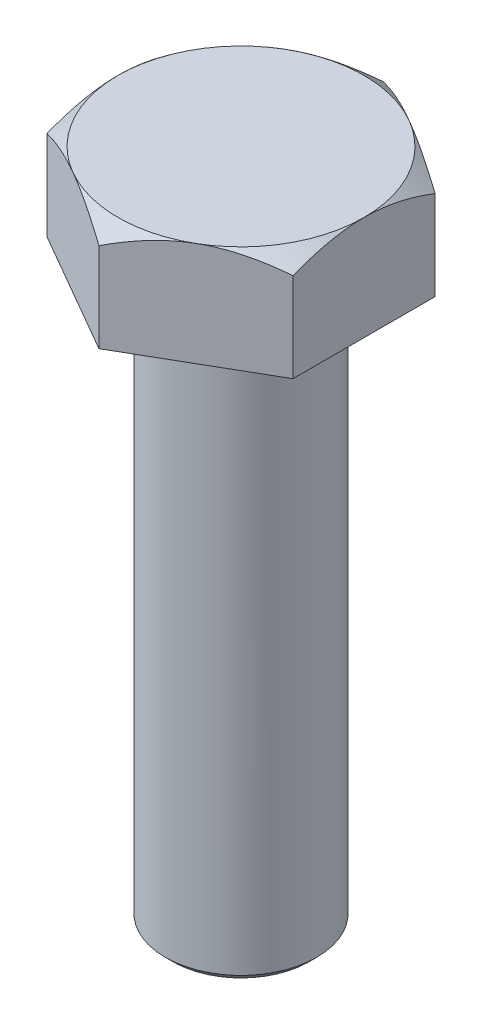
ISO-10303-21;
HEADER;
FILE_DESCRIPTION(('STEP AP214'),'2;1');
FILE_NAME('part.step','',(''),(''),'','','');
FILE_SCHEMA(('AUTOMOTIVE_DESIGN { 1 0 10303 214 1 1 1 1 }'));
ENDSEC;
DATA;
#1=APPLICATION_CONTEXT('core data for automotive mechanical design processes');
#2=APPLICATION_PROTOCOL_DEFINITION('international standard','automotive_design',2000,#1);
#3=PRODUCT_CONTEXT('',#1,'mechanical');
#4=PRODUCT('Part','Part','',(#3));
#5=PRODUCT_RELATED_PRODUCT_CATEGORY('part','',(#4));
#6=PRODUCT_DEFINITION_FORMATION('','',#4);
#7=PRODUCT_DEFINITION_CONTEXT('part definition',#1,'design');
#8=PRODUCT_DEFINITION('design','',#6,#7);
#9=PRODUCT_DEFINITION_SHAPE('','',#8);
#10=(LENGTH_UNIT() NAMED_UNIT(*) SI_UNIT(.MILLI.,.METRE.));
#11=(NAMED_UNIT(*) PLANE_ANGLE_UNIT() SI_UNIT($,.RADIAN.));
#12=(NAMED_UNIT(*) SI_UNIT($,.STERADIAN.) SOLID_ANGLE_UNIT());
#13=UNCERTAINTY_MEASURE_WITH_UNIT(LENGTH_MEASURE(1.E-05),#10,'distance_accuracy_value','');
#14=(GEOMETRIC_REPRESENTATION_CONTEXT(3) GLOBAL_UNCERTAINTY_ASSIGNED_CONTEXT((#13)) GLOBAL_UNIT_ASSIGNED_CONTEXT((#10,
#11,#12)) REPRESENTATION_CONTEXT('',''));
#15=CARTESIAN_POINT('',(0.,0.,0.));
#16=DIRECTION('',(0.,0.,1.));
#17=DIRECTION('',(1.,0.,0.));
#18=AXIS2_PLACEMENT_3D('',#15,#16,#17);
#19=CARTESIAN_POINT('',(-6.5,35.5,3.75277674973257));
#20=DIRECTION('',(0.5,0.,-0.866025403784438));
#21=DIRECTION('',(-0.866025403784439,0.,-0.5));
#22=AXIS2_PLACEMENT_3D('',#19,#20,#21);
#23=PLANE('',#22);
#24=CARTESIAN_POINT('',(-6.5002,34.7142852870091,3.75266127967873));
#25=CARTESIAN_POINT('',(-6.26849183615579,34.818755788061,3.88643805044762));
#26=CARTESIAN_POINT('',(-6.03413643113228,34.9161448767212,4.02174320662399));
#27=CARTESIAN_POINT('',(-5.55955625459309,35.0926798919872,4.29574219930095));
#28=CARTESIAN_POINT('',(-5.31931535970643,35.1717675567921,4.43444534463412));
#29=CARTESIAN_POINT('',(-4.83614836656162,35.3062674154687,4.71340193818982));
#30=CARTESIAN_POINT('',(-4.59326932277981,35.3618969702887,4.85362821949777));
#31=CARTESIAN_POINT('',(-4.22653437863661,35.425291328794,5.06536273822008));
#32=CARTESIAN_POINT('',(-4.10394057395098,35.4430777321858,5.13614230435631));
#33=CARTESIAN_POINT('',(-3.85814692242963,35.4716314506099,5.27805133522726));
#34=CARTESIAN_POINT('',(-3.73494716194625,35.4823997381448,5.34918075010644));
#35=CARTESIAN_POINT('',(-3.48636363850025,35.4967758792946,5.4927005142841));
#36=CARTESIAN_POINT('',(-3.36097505053948,35.5002728507988,5.56509364929655));
#37=CARTESIAN_POINT('',(-3.11021045258304,35.4996938835069,5.70987265742993));
#38=CARTESIAN_POINT('',(-2.98483444266605,35.4956178999724,5.78225853050543));
#39=CARTESIAN_POINT('',(-2.73437881037612,35.4799860889839,5.92685915722808));
#40=CARTESIAN_POINT('',(-2.60929934035414,35.4684270141369,5.99907382291536));
#41=CARTESIAN_POINT('',(-2.3597915590094,35.438101268874,6.14312720763965));
#42=CARTESIAN_POINT('',(-2.2353633393163,35.419333610464,6.21496587377425));
#43=CARTESIAN_POINT('',(-1.86352330890096,35.3528145131007,6.42964781543003));
#44=CARTESIAN_POINT('',(-1.61745179224297,35.294839870839,6.57171727181242));
#45=CARTESIAN_POINT('',(-1.13040722975498,35.1559389409286,6.8529125810722));
#46=CARTESIAN_POINT('',(-0.889433126713771,35.07501746365,6.99203904433077));
#47=CARTESIAN_POINT('',(-0.541329471029829,34.9433811950942,7.19301678364579));
#48=CARTESIAN_POINT('',(-0.432091820985262,34.8999061969859,7.25608517030466));
#49=CARTESIAN_POINT('',(-0.214996676551416,34.8095612104902,7.38142511038331));
#50=CARTESIAN_POINT('',(-0.107136313351479,34.7627004273152,7.44369832011168));
#51=CARTESIAN_POINT('',(0.00020000000000236,34.7142852870092,7.50566896951898));
#52=B_SPLINE_CURVE_WITH_KNOTS('',3,(#24,#25,#26,#27,#28,#29,#30,#31,#32,#33,#34,#35,#36,#37,#38,
#39,#40,#41,#42,#43,#44,#45,#46,#47,#48,#49,#50,#51),.UNSPECIFIED.,.F.,.F.,(4,2,2,2,2,2,2,2,2,2,
2,2,2,4),(0.,0.861976942107793,1.72666131720615,2.5831475047865,3.01101814330345,
3.43882947904054,3.87311815490263,4.30740939640629,4.74188923116733,5.17642863612659,
6.04514696556895,6.91368331909186,7.31389878440711,7.71306436975967),.UNSPECIFIED.);
#53=CARTESIAN_POINT('',(-6.5,34.7143755041844,3.75277674973257));
#54=VERTEX_POINT('',#53);
#55=CARTESIAN_POINT('',(-3.25,35.5,5.62916512459885));
#56=VERTEX_POINT('',#55);
#57=EDGE_CURVE('E173',#54,#56,#52,.T.);
#58=ORIENTED_EDGE('',*,*,#57,.F.);
#59=DIRECTION('',(0.,-1.,0.));
#60=VECTOR('',#59,1.);
#61=CARTESIAN_POINT('',(-6.5,35.5,3.75277674973257));
#62=LINE('',#61,#60);
#63=CARTESIAN_POINT('',(-6.5,30.,3.75277674973257));
#64=VERTEX_POINT('',#63);
#65=EDGE_CURVE('E192',#54,#64,#62,.T.);
#66=ORIENTED_EDGE('',*,*,#65,.T.);
#67=DIRECTION('',(0.866025403784439,0.,0.5));
#68=VECTOR('',#67,1.);
#69=CARTESIAN_POINT('',(-6.5,30.,3.75277674973257));
#70=LINE('',#69,#68);
#71=CARTESIAN_POINT('',(0.,30.,7.50555349946514));
#72=VERTEX_POINT('',#71);
#73=EDGE_CURVE('E175',#64,#72,#70,.T.);
#74=ORIENTED_EDGE('',*,*,#73,.T.);
#75=DIRECTION('',(0.,-1.,0.));
#76=VECTOR('',#75,1.);
#77=CARTESIAN_POINT('',(0.,35.5,7.50555349946514));
#78=LINE('',#77,#76);
#79=CARTESIAN_POINT('',(0.,34.7143755041844,7.50555349946514));
#80=VERTEX_POINT('',#79);
#81=EDGE_CURVE('E201',#80,#72,#78,.T.);
#82=ORIENTED_EDGE('',*,*,#81,.F.);
#83=EDGE_CURVE('E168',#56,#80,#52,.T.);
#84=ORIENTED_EDGE('',*,*,#83,.F.);
#85=EDGE_LOOP('',(#58,#66,#74,#82,#84));
#86=FACE_BOUND('',#85,.T.);
#87=ADVANCED_FACE('F34',(#86),#23,.F.);
#88=CARTESIAN_POINT('',(0.,35.5,7.50555349946514));
#89=DIRECTION('',(-0.5,0.,-0.866025403784438));
#90=DIRECTION('',(-0.866025403784439,0.,0.5));
#91=AXIS2_PLACEMENT_3D('',#88,#89,#90);
#92=PLANE('',#91);
#93=CARTESIAN_POINT('',(-0.000200000000001718,34.7142852870091,7.50566896951898));
#94=CARTESIAN_POINT('',(0.231508163844212,34.818755788061,7.37189219875008));
#95=CARTESIAN_POINT('',(0.465863568867719,34.9161448767212,7.23658704257372));
#96=CARTESIAN_POINT('',(0.940443745406907,35.0926798919872,6.96258804989676));
#97=CARTESIAN_POINT('',(1.18068464029357,35.1717675567921,6.82388490456359));
#98=CARTESIAN_POINT('',(1.66385163343838,35.3062674154687,6.54492831100789));
#99=CARTESIAN_POINT('',(1.90673067722019,35.3618969702887,6.40470202969994));
#100=CARTESIAN_POINT('',(2.27346562136339,35.425291328794,6.19296751097762));
#101=CARTESIAN_POINT('',(2.39605942604902,35.4430777321858,6.12218794484139));
#102=CARTESIAN_POINT('',(2.64185307757036,35.4716314506099,5.98027891397044));
#103=CARTESIAN_POINT('',(2.76505283805375,35.4823997381448,5.90914949909127));
#104=CARTESIAN_POINT('',(3.01363636149975,35.4967758792946,5.76562973491361));
#105=CARTESIAN_POINT('',(3.13902494946052,35.5002728507988,5.69323659990115));
#106=CARTESIAN_POINT('',(3.38978954741696,35.4996938835069,5.54845759176777));
#107=CARTESIAN_POINT('',(3.51516555733394,35.4956178999724,5.47607171869228));
#108=CARTESIAN_POINT('',(3.76562118962388,35.4799860889838,5.33147109196963));
#109=CARTESIAN_POINT('',(3.89070065964586,35.4684270141369,5.25925642628234));
#110=CARTESIAN_POINT('',(4.1402084409906,35.438101268874,5.11520304155805));
#111=CARTESIAN_POINT('',(4.26463666068369,35.419333610464,5.04336437542346));
#112=CARTESIAN_POINT('',(4.63647669109904,35.3528145131007,4.82868243376768));
#113=CARTESIAN_POINT('',(4.88254820775703,35.294839870839,4.68661297738529));
#114=CARTESIAN_POINT('',(5.36959277024502,35.1559389409286,4.4054176681255));
#115=CARTESIAN_POINT('',(5.61056687328623,35.0750174636501,4.26629120486693));
#116=CARTESIAN_POINT('',(5.95867052897017,34.9433811950943,4.06531346555192));
#117=CARTESIAN_POINT('',(6.06790817901473,34.8999061969859,4.00224507889305));
#118=CARTESIAN_POINT('',(6.28500332344858,34.8095612104902,3.8769051388144));
#119=CARTESIAN_POINT('',(6.39286368664852,34.7627004273152,3.81463192908603));
#120=CARTESIAN_POINT('',(6.5002,34.7142852870092,3.75266127967873));
#121=B_SPLINE_CURVE_WITH_KNOTS('',3,(#93,#94,#95,#96,#97,#98,#99,#100,#101,#102,#103,#104,#105,
#106,#107,#108,#109,#110,#111,#112,#113,#114,#115,#116,#117,#118,#119,#120),.UNSPECIFIED.,.F.,
.F.,(4,2,2,2,2,2,2,2,2,2,2,2,2,4),(0.,0.861976942107792,1.72666131720615,2.5831475047865,
3.01101814330345,3.43882947904054,3.87311815490263,4.30740939640629,4.74188923116733,
5.17642863612658,6.04514696556895,6.91368331909186,7.31389878440711,7.71306436975967),.UNSPECIFIED.);
#122=CARTESIAN_POINT('',(3.25,35.5,5.62916512459885));
#123=VERTEX_POINT('',#122);
#124=EDGE_CURVE('E174',#80,#123,#121,.T.);
#125=ORIENTED_EDGE('',*,*,#124,.F.);
#126=ORIENTED_EDGE('',*,*,#81,.T.);
#127=DIRECTION('',(0.866025403784439,0.,-0.5));
#128=VECTOR('',#127,1.);
#129=CARTESIAN_POINT('',(0.,30.,7.50555349946514));
#130=LINE('',#129,#128);
#131=CARTESIAN_POINT('',(6.5,30.,3.75277674973257));
#132=VERTEX_POINT('',#131);
#133=EDGE_CURVE('E178',#72,#132,#130,.T.);
#134=ORIENTED_EDGE('',*,*,#133,.T.);
#135=DIRECTION('',(0.,-1.,0.));
#136=VECTOR('',#135,1.);
#137=CARTESIAN_POINT('',(6.5,35.5,3.75277674973257));
#138=LINE('',#137,#136);
#139=CARTESIAN_POINT('',(6.5,34.7143755041844,3.75277674973257));
#140=VERTEX_POINT('',#139);
#141=EDGE_CURVE('E199',#140,#132,#138,.T.);
#142=ORIENTED_EDGE('',*,*,#141,.F.);
#143=EDGE_CURVE('E110',#123,#140,#121,.T.);
#144=ORIENTED_EDGE('',*,*,#143,.F.);
#145=EDGE_LOOP('',(#125,#126,#134,#142,#144));
#146=FACE_BOUND('',#145,.T.);
#147=ADVANCED_FACE('F155',(#146),#92,.F.);
#148=CARTESIAN_POINT('',(6.5,35.5,3.75277674973257));
#149=DIRECTION('',(-1.,0.,0.));
#150=DIRECTION('',(0.,0.,1.));
#151=AXIS2_PLACEMENT_3D('',#148,#149,#150);
#152=PLANE('',#151);
#153=CARTESIAN_POINT('',(6.49999999999999,32.0576259629293,-8.7573775439131));
#154=CARTESIAN_POINT('',(6.49999999999999,32.2007873259403,-8.52912506204232));
#155=CARTESIAN_POINT('',(6.49999999999999,32.3425767251503,-8.29999766626221));
#156=CARTESIAN_POINT('',(6.49999999999999,32.6227298730685,-7.83959554875494));
#157=CARTESIAN_POINT('',(6.49999999999999,32.761092908265,-7.60832039333499));
#158=CARTESIAN_POINT('',(6.49999999999999,33.0345691404348,-7.14175435929315));
#159=CARTESIAN_POINT('',(6.49999999999999,33.1696541956528,-6.90644692936201));
#160=CARTESIAN_POINT('',(6.49999999999999,33.4346049980946,-6.43292116249189));
#161=CARTESIAN_POINT('',(6.49999999999999,33.5644710540464,-6.19470299882656));
#162=CARTESIAN_POINT('',(6.49999999999999,33.8239350678482,-5.7030759023016));
#163=CARTESIAN_POINT('',(6.5,33.9532080909825,-5.44949457697888));
#164=CARTESIAN_POINT('',(6.5,34.2027351997037,-4.93786027676595));
#165=CARTESIAN_POINT('',(6.5,34.3229880443171,-4.67980669258362));
#166=CARTESIAN_POINT('',(6.5,34.55165641351,-4.15924350117993));
#167=CARTESIAN_POINT('',(6.5,34.6601012001704,-3.89674686227773));
#168=CARTESIAN_POINT('',(6.5,34.862268323803,-3.36618937632092));
#169=CARTESIAN_POINT('',(6.5,34.9559963369902,-3.0981307199071));
#170=CARTESIAN_POINT('',(6.5,35.1257294167069,-2.55343517877316));
#171=CARTESIAN_POINT('',(6.5,35.2015479452172,-2.27673932818551));
#172=CARTESIAN_POINT('',(6.5,35.3297768853184,-1.71783833968318));
#173=CARTESIAN_POINT('',(6.5,35.3821900704915,-1.43563385869159));
#174=CARTESIAN_POINT('',(6.5,35.4399370840294,-1.01206552100857));
#175=CARTESIAN_POINT('',(6.5,35.4556573523712,-0.872073638912203));
#176=CARTESIAN_POINT('',(6.5,35.4801786727414,-0.591492014508092));
#177=CARTESIAN_POINT('',(6.5,35.4889806527419,-0.450902354926505));
#178=CARTESIAN_POINT('',(6.5,35.4994616946384,-0.169452364006));
#179=CARTESIAN_POINT('',(6.5,35.5011405849447,-0.0285920262284293));
#180=CARTESIAN_POINT('',(6.5,35.4973459893773,0.25302077100524));
#181=CARTESIAN_POINT('',(6.5,35.4918725976269,0.393773231856595));
#182=CARTESIAN_POINT('',(6.5,35.4662937548648,0.793139753593917));
#183=CARTESIAN_POINT('',(6.5,35.4377507670825,1.05125365317115));
#184=CARTESIAN_POINT('',(6.5,35.3587609347695,1.564012609285));
#185=CARTESIAN_POINT('',(6.5,35.3083124071314,1.81865739772232));
#186=CARTESIAN_POINT('',(6.5,35.1874122186409,2.32840664943206));
#187=CARTESIAN_POINT('',(6.5,35.116586063468,2.58342133726952));
#188=CARTESIAN_POINT('',(6.5,34.9982899518855,2.96206587378063));
#189=CARTESIAN_POINT('',(6.5,34.9568492069333,3.08763245935672));
#190=CARTESIAN_POINT('',(6.5,34.870347410278,3.33751171486163));
#191=CARTESIAN_POINT('',(6.5,34.8252864432198,3.46182441403127));
#192=CARTESIAN_POINT('',(6.5,34.6939578201203,3.80984586752319));
#193=CARTESIAN_POINT('',(6.5,34.6039849279513,4.03215864732452));
#194=CARTESIAN_POINT('',(6.5,34.415376115315,4.47309867978745));
#195=CARTESIAN_POINT('',(6.5,34.3167383027927,4.69172511502175));
#196=CARTESIAN_POINT('',(6.5,34.1123427240651,5.12583582830636));
#197=CARTESIAN_POINT('',(6.5,34.0065789939763,5.34131728606079));
#198=CARTESIAN_POINT('',(6.5,33.7893134582026,5.76933603358322));
#199=CARTESIAN_POINT('',(6.5,33.6778120450854,5.98187352351574));
#200=CARTESIAN_POINT('',(6.5,33.4495821978659,6.40535419742598));
#201=CARTESIAN_POINT('',(6.5,33.3328324454883,6.61628585776562));
#202=CARTESIAN_POINT('',(6.5,33.0953956135492,7.03592529331087));
#203=CARTESIAN_POINT('',(6.5,32.9747083799628,7.24463298109529));
#204=CARTESIAN_POINT('',(6.5,32.6078806347482,7.86768304831454));
#205=CARTESIAN_POINT('',(6.5,32.3568635833025,8.27915431038189));
#206=CARTESIAN_POINT('',(6.5,31.8698003524806,9.05770619751265));
#207=CARTESIAN_POINT('',(6.5,31.6345802331535,9.42530805736816));
#208=CARTESIAN_POINT('',(6.5,31.1584197585226,10.156842652935));
#209=CARTESIAN_POINT('',(6.5,30.9174787509979,10.5207749634886));
#210=CARTESIAN_POINT('',(6.5,30.4336425886717,11.2420966392054));
#211=CARTESIAN_POINT('',(6.5,30.1907906784601,11.5995150819311));
#212=CARTESIAN_POINT('',(6.5,29.8240078978298,12.1338675131494));
#213=CARTESIAN_POINT('',(6.5,29.7013417045957,12.3116716723612));
#214=CARTESIAN_POINT('',(6.5,29.455253636156,12.6667544846516));
#215=CARTESIAN_POINT('',(6.5,29.3318317663439,12.8440331414674));
#216=CARTESIAN_POINT('',(6.5,29.2080746793031,13.0210774654573));
#217=B_SPLINE_CURVE_WITH_KNOTS('',3,(#153,#154,#155,#156,#157,#158,#159,#160,#161,#162,#163,
#164,#165,#166,#167,#168,#169,#170,#171,#172,#173,#174,#175,#176,#177,#178,#179,#180,#181,#182,
#183,#184,#185,#186,#187,#188,#189,#190,#191,#192,#193,#194,#195,#196,#197,#198,#199,#200,#201,
#202,#203,#204,#205,#206,#207,#208,#209,#210,#211,#212,#213,#214,#215,#216),.UNSPECIFIED.,.F.,
.F.,(4,2,2,2,2,2,2,2,2,2,2,2,2,2,2,2,2,2,2,2,2,2,2,2,2,2,2,2,2,2,2,4),(0.,0.808313554424561,
1.6167940415346,2.43071615282562,3.24459004578201,4.09834310240795,4.95221340162635,
5.80391706747894,6.65529142256432,7.51517673000065,8.37496011216908,8.79743082201075,
9.21984485482608,9.64226906321071,10.0646877126011,10.842609797659,11.6205916647681,
12.4139002568207,12.8105416508816,13.2071737737184,13.9264149420713,14.645813554751,
15.3658219167113,16.0857810815851,16.8089893705847,17.5322259837711,18.9780091399686,
20.2872030877875,21.5965470163298,22.8928732460373,23.5409085683929,24.1889392708077),.UNSPECIFIED.);
#218=CARTESIAN_POINT('',(6.5,35.5,0.));
#219=VERTEX_POINT('',#218);
#220=EDGE_CURVE('E106',#140,#219,#217,.F.);
#221=ORIENTED_EDGE('',*,*,#220,.F.);
#222=ORIENTED_EDGE('',*,*,#141,.T.);
#223=DIRECTION('',(0.,0.,-1.));
#224=VECTOR('',#223,1.);
#225=CARTESIAN_POINT('',(6.5,30.,3.75277674973257));
#226=LINE('',#225,#224);
#227=CARTESIAN_POINT('',(6.5,30.,-3.75277674973257));
#228=VERTEX_POINT('',#227);
#229=EDGE_CURVE('E181',#132,#228,#226,.T.);
#230=ORIENTED_EDGE('',*,*,#229,.T.);
#231=DIRECTION('',(0.,-1.,0.));
#232=VECTOR('',#231,1.);
#233=CARTESIAN_POINT('',(6.5,35.5,-3.75277674973257));
#234=LINE('',#233,#232);
#235=CARTESIAN_POINT('',(6.49999999999999,34.7143755041844,-3.75277674973257));
#236=VERTEX_POINT('',#235);
#237=EDGE_CURVE('E130',#236,#228,#234,.T.);
#238=ORIENTED_EDGE('',*,*,#237,.F.);
#239=EDGE_CURVE('E114',#219,#236,#217,.F.);
#240=ORIENTED_EDGE('',*,*,#239,.F.);
#241=EDGE_LOOP('',(#221,#222,#230,#238,#240));
#242=FACE_BOUND('',#241,.T.);
#243=ADVANCED_FACE('F128',(#242),#152,.F.);
#244=CARTESIAN_POINT('',(6.5,35.5,-3.75277674973257));
#245=DIRECTION('',(-0.5,0.,0.866025403784439));
#246=DIRECTION('',(0.866025403784439,0.,0.5));
#247=AXIS2_PLACEMENT_3D('',#244,#245,#246);
#248=PLANE('',#247);
#249=CARTESIAN_POINT('',(6.5002,34.7142852870091,-3.75266127967873));
#250=CARTESIAN_POINT('',(6.26849183615578,34.818755788061,-3.88643805044763));
#251=CARTESIAN_POINT('',(6.03413643113227,34.9161448767212,-4.02174320662399));
#252=CARTESIAN_POINT('',(5.55955625459309,35.0926798919872,-4.29574219930095));
#253=CARTESIAN_POINT('',(5.31931535970642,35.1717675567921,-4.43444534463413));
#254=CARTESIAN_POINT('',(4.83614836656161,35.3062674154687,-4.71340193818982));
#255=CARTESIAN_POINT('',(4.5932693227798,35.3618969702887,-4.85362821949777));
#256=CARTESIAN_POINT('',(4.2265343786366,35.425291328794,-5.06536273822009));
#257=CARTESIAN_POINT('',(4.10394057395097,35.4430777321858,-5.13614230435632));
#258=CARTESIAN_POINT('',(3.85814692242963,35.4716314506099,-5.27805133522727));
#259=CARTESIAN_POINT('',(3.73494716194625,35.4823997381448,-5.34918075010644));
#260=CARTESIAN_POINT('',(3.48636363850024,35.4967758792946,-5.4927005142841));
#261=CARTESIAN_POINT('',(3.36097505053947,35.5002728507988,-5.56509364929656));
#262=CARTESIAN_POINT('',(3.11021045258303,35.4996938835069,-5.70987265742994));
#263=CARTESIAN_POINT('',(2.98483444266605,35.4956178999724,-5.78225853050543));
#264=CARTESIAN_POINT('',(2.73437881037612,35.4799860889838,-5.92685915722808));
#265=CARTESIAN_POINT('',(2.60929934035413,35.4684270141369,-5.99907382291537));
#266=CARTESIAN_POINT('',(2.3597915590094,35.438101268874,-6.14312720763966));
#267=CARTESIAN_POINT('',(2.2353633393163,35.419333610464,-6.21496587377425));
#268=CARTESIAN_POINT('',(1.86352330890095,35.3528145131007,-6.42964781543003));
#269=CARTESIAN_POINT('',(1.61745179224296,35.294839870839,-6.57171727181242));
#270=CARTESIAN_POINT('',(1.13040722975497,35.1559389409286,-6.85291258107221));
#271=CARTESIAN_POINT('',(0.889433126713765,35.07501746365,-6.99203904433078));
#272=CARTESIAN_POINT('',(0.541329471029824,34.9433811950942,-7.19301678364579));
#273=CARTESIAN_POINT('',(0.432091820985258,34.8999061969859,-7.25608517030466));
#274=CARTESIAN_POINT('',(0.214996676551412,34.8095612104902,-7.38142511038331));
#275=CARTESIAN_POINT('',(0.107136313351477,34.7627004273152,-7.44369832011168));
#276=CARTESIAN_POINT('',(-0.000200000000004365,34.7142852870092,-7.50566896951898));
#277=B_SPLINE_CURVE_WITH_KNOTS('',3,(#249,#250,#251,#252,#253,#254,#255,#256,#257,#258,#259,
#260,#261,#262,#263,#264,#265,#266,#267,#268,#269,#270,#271,#272,#273,#274,#275,#276),
.UNSPECIFIED.,.F.,.F.,(4,2,2,2,2,2,2,2,2,2,2,2,2,4),(0.,0.861976942107791,1.72666131720615,
2.5831475047865,3.01101814330345,3.43882947904054,3.87311815490263,4.30740939640629,
4.74188923116733,5.17642863612659,6.04514696556895,6.91368331909186,7.31389878440711,
7.71306436975967),.UNSPECIFIED.);
#278=CARTESIAN_POINT('',(3.25,35.5,-5.62916512459885));
#279=VERTEX_POINT('',#278);
#280=EDGE_CURVE('E119',#236,#279,#277,.T.);
#281=ORIENTED_EDGE('',*,*,#280,.F.);
#282=ORIENTED_EDGE('',*,*,#237,.T.);
#283=DIRECTION('',(-0.866025403784438,0.,-0.5));
#284=VECTOR('',#283,1.);
#285=CARTESIAN_POINT('',(6.5,30.,-3.75277674973257));
#286=LINE('',#285,#284);
#287=CARTESIAN_POINT('',(0.,30.,-7.50555349946514));
#288=VERTEX_POINT('',#287);
#289=EDGE_CURVE('E183',#228,#288,#286,.T.);
#290=ORIENTED_EDGE('',*,*,#289,.T.);
#291=DIRECTION('',(0.,-1.,0.));
#292=VECTOR('',#291,1.);
#293=CARTESIAN_POINT('',(0.,35.5,-7.50555349946514));
#294=LINE('',#293,#292);
#295=CARTESIAN_POINT('',(0.,34.7143755041844,-7.50555349946514));
#296=VERTEX_POINT('',#295);
#297=EDGE_CURVE('E196',#296,#288,#294,.T.);
#298=ORIENTED_EDGE('',*,*,#297,.F.);
#299=EDGE_CURVE('E131',#279,#296,#277,.T.);
#300=ORIENTED_EDGE('',*,*,#299,.F.);
#301=EDGE_LOOP('',(#281,#282,#290,#298,#300));
#302=FACE_BOUND('',#301,.T.);
#303=ADVANCED_FACE('F154',(#302),#248,.F.);
#304=CARTESIAN_POINT('',(0.,35.5,-7.50555349946514));
#305=DIRECTION('',(0.5,0.,0.866025403784438));
#306=DIRECTION('',(0.866025403784438,0.,-0.5));
#307=AXIS2_PLACEMENT_3D('',#304,#305,#306);
#308=PLANE('',#307);
#309=CARTESIAN_POINT('',(0.000200000000000124,34.7142852870091,-7.50566896951898));
#310=CARTESIAN_POINT('',(-0.231508163844215,34.818755788061,-7.37189219875008));
#311=CARTESIAN_POINT('',(-0.465863568867722,34.9161448767212,-7.23658704257372));
#312=CARTESIAN_POINT('',(-0.94044374540691,35.0926798919872,-6.96258804989676));
#313=CARTESIAN_POINT('',(-1.18068464029358,35.1717675567921,-6.82388490456358));
#314=CARTESIAN_POINT('',(-1.66385163343838,35.3062674154687,-6.54492831100789));
#315=CARTESIAN_POINT('',(-1.9067306772202,35.3618969702887,-6.40470202969994));
#316=CARTESIAN_POINT('',(-2.2734656213634,35.425291328794,-6.19296751097762));
#317=CARTESIAN_POINT('',(-2.39605942604903,35.4430777321858,-6.12218794484139));
#318=CARTESIAN_POINT('',(-2.64185307757037,35.4716314506099,-5.98027891397044));
#319=CARTESIAN_POINT('',(-2.76505283805375,35.4823997381448,-5.90914949909127));
#320=CARTESIAN_POINT('',(-3.01363636149976,35.4967758792946,-5.76562973491361));
#321=CARTESIAN_POINT('',(-3.13902494946053,35.5002728507988,-5.69323659990115));
#322=CARTESIAN_POINT('',(-3.38978954741696,35.4996938835069,-5.54845759176777));
#323=CARTESIAN_POINT('',(-3.51516555733395,35.4956178999724,-5.47607171869228));
#324=CARTESIAN_POINT('',(-3.76562118962388,35.4799860889838,-5.33147109196963));
#325=CARTESIAN_POINT('',(-3.89070065964587,35.4684270141369,-5.25925642628234));
#326=CARTESIAN_POINT('',(-4.1402084409906,35.438101268874,-5.11520304155805));
#327=CARTESIAN_POINT('',(-4.2646366606837,35.419333610464,-5.04336437542346));
#328=CARTESIAN_POINT('',(-4.63647669109905,35.3528145131007,-4.82868243376768));
#329=CARTESIAN_POINT('',(-4.88254820775704,35.294839870839,-4.68661297738528));
#330=CARTESIAN_POINT('',(-5.36959277024503,35.1559389409286,-4.4054176681255));
#331=CARTESIAN_POINT('',(-5.61056687328623,35.07501746365,-4.26629120486693));
#332=CARTESIAN_POINT('',(-5.95867052897018,34.9433811950942,-4.06531346555191));
#333=CARTESIAN_POINT('',(-6.06790817901474,34.8999061969859,-4.00224507889304));
#334=CARTESIAN_POINT('',(-6.28500332344859,34.8095612104902,-3.8769051388144));
#335=CARTESIAN_POINT('',(-6.39286368664852,34.7627004273152,-3.81463192908603));
#336=CARTESIAN_POINT('',(-6.50020000000001,34.7142852870092,-3.75266127967873));
#337=B_SPLINE_CURVE_WITH_KNOTS('',3,(#309,#310,#311,#312,#313,#314,#315,#316,#317,#318,#319,
#320,#321,#322,#323,#324,#325,#326,#327,#328,#329,#330,#331,#332,#333,#334,#335,#336),
.UNSPECIFIED.,.F.,.F.,(4,2,2,2,2,2,2,2,2,2,2,2,2,4),(0.,0.861976942107793,1.72666131720615,
2.5831475047865,3.01101814330345,3.43882947904054,3.87311815490264,4.30740939640629,
4.74188923116734,5.17642863612659,6.04514696556895,6.91368331909187,7.31389878440711,
7.71306436975967),.UNSPECIFIED.);
#338=CARTESIAN_POINT('',(-3.25,35.5,-5.62916512459885));
#339=VERTEX_POINT('',#338);
#340=EDGE_CURVE('E224',#296,#339,#337,.T.);
#341=ORIENTED_EDGE('',*,*,#340,.F.);
#342=ORIENTED_EDGE('',*,*,#297,.T.);
#343=DIRECTION('',(-0.866025403784438,0.,0.5));
#344=VECTOR('',#343,1.);
#345=CARTESIAN_POINT('',(0.,30.,-7.50555349946514));
#346=LINE('',#345,#344);
#347=CARTESIAN_POINT('',(-6.5,30.,-3.75277674973257));
#348=VERTEX_POINT('',#347);
#349=EDGE_CURVE('E186',#288,#348,#346,.T.);
#350=ORIENTED_EDGE('',*,*,#349,.T.);
#351=DIRECTION('',(0.,-1.,0.));
#352=VECTOR('',#351,1.);
#353=CARTESIAN_POINT('',(-6.5,35.5,-3.75277674973257));
#354=LINE('',#353,#352);
#355=CARTESIAN_POINT('',(-6.5,34.7143755041844,-3.75277674973257));
#356=VERTEX_POINT('',#355);
#357=EDGE_CURVE('E194',#356,#348,#354,.T.);
#358=ORIENTED_EDGE('',*,*,#357,.F.);
#359=EDGE_CURVE('E222',#339,#356,#337,.T.);
#360=ORIENTED_EDGE('',*,*,#359,.F.);
#361=EDGE_LOOP('',(#341,#342,#350,#358,#360));
#362=FACE_BOUND('',#361,.T.);
#363=ADVANCED_FACE('F223',(#362),#308,.F.);
#364=CARTESIAN_POINT('',(-6.5,35.5,-3.75277674973257));
#365=DIRECTION('',(1.,0.,0.));
#366=DIRECTION('',(0.,0.,-1.));
#367=AXIS2_PLACEMENT_3D('',#364,#365,#366);
#368=PLANE('',#367);
#369=CARTESIAN_POINT('',(-6.5,32.0576259629293,-8.75737754391308));
#370=CARTESIAN_POINT('',(-6.5,32.2007873259403,-8.5291250620423));
#371=CARTESIAN_POINT('',(-6.5,32.3425767251503,-8.2999976662622));
#372=CARTESIAN_POINT('',(-6.5,32.6227298730685,-7.83959554875492));
#373=CARTESIAN_POINT('',(-6.5,32.761092908265,-7.60832039333497));
#374=CARTESIAN_POINT('',(-6.5,33.0345691404348,-7.14175435929314));
#375=CARTESIAN_POINT('',(-6.5,33.1696541956528,-6.906446929362));
#376=CARTESIAN_POINT('',(-6.5,33.4346049980946,-6.43292116249188));
#377=CARTESIAN_POINT('',(-6.5,33.5644710540464,-6.19470299882656));
#378=CARTESIAN_POINT('',(-6.5,33.8239350678482,-5.70307590230159));
#379=CARTESIAN_POINT('',(-6.5,33.9532080909825,-5.44949457697888));
#380=CARTESIAN_POINT('',(-6.5,34.2027351997037,-4.93786027676595));
#381=CARTESIAN_POINT('',(-6.5,34.322988044317,-4.67980669258362));
#382=CARTESIAN_POINT('',(-6.5,34.55165641351,-4.15924350117993));
#383=CARTESIAN_POINT('',(-6.5,34.6601012001704,-3.89674686227773));
#384=CARTESIAN_POINT('',(-6.5,34.862268323803,-3.36618937632092));
#385=CARTESIAN_POINT('',(-6.5,34.9559963369902,-3.0981307199071));
#386=CARTESIAN_POINT('',(-6.5,35.1257294167069,-2.55343517877316));
#387=CARTESIAN_POINT('',(-6.5,35.2015479452172,-2.2767393281855));
#388=CARTESIAN_POINT('',(-6.5,35.3297768853184,-1.71783833968318));
#389=CARTESIAN_POINT('',(-6.5,35.3821900704915,-1.43563385869159));
#390=CARTESIAN_POINT('',(-6.5,35.4399370840294,-1.01206552100857));
#391=CARTESIAN_POINT('',(-6.5,35.4556573523712,-0.872073638912198));
#392=CARTESIAN_POINT('',(-6.5,35.4801786727414,-0.591492014508086));
#393=CARTESIAN_POINT('',(-6.5,35.4889806527419,-0.450902354926498));
#394=CARTESIAN_POINT('',(-6.5,35.4994616946384,-0.169452364005992));
#395=CARTESIAN_POINT('',(-6.5,35.5011405849447,-0.0285920262284202));
#396=CARTESIAN_POINT('',(-6.5,35.4973459893773,0.25302077100525));
#397=CARTESIAN_POINT('',(-6.5,35.4918725976268,0.393773231856605));
#398=CARTESIAN_POINT('',(-6.5,35.4662937548648,0.793139753593927));
#399=CARTESIAN_POINT('',(-6.5,35.4377507670825,1.05125365317116));
#400=CARTESIAN_POINT('',(-6.5,35.3587609347695,1.56401260928501));
#401=CARTESIAN_POINT('',(-6.5,35.3083124071314,1.81865739772233));
#402=CARTESIAN_POINT('',(-6.5,35.1874122186409,2.32840664943207));
#403=CARTESIAN_POINT('',(-6.5,35.116586063468,2.58342133726953));
#404=CARTESIAN_POINT('',(-6.5,34.9982899518855,2.96206587378064));
#405=CARTESIAN_POINT('',(-6.5,34.9568492069333,3.08763245935672));
#406=CARTESIAN_POINT('',(-6.5,34.870347410278,3.33751171486163));
#407=CARTESIAN_POINT('',(-6.5,34.8252864432198,3.46182441403128));
#408=CARTESIAN_POINT('',(-6.5,34.6939578201203,3.80984586752319));
#409=CARTESIAN_POINT('',(-6.5,34.6039849279513,4.03215864732452));
#410=CARTESIAN_POINT('',(-6.5,34.415376115315,4.47309867978745));
#411=CARTESIAN_POINT('',(-6.5,34.3167383027927,4.69172511502175));
#412=CARTESIAN_POINT('',(-6.5,34.1123427240651,5.12583582830636));
#413=CARTESIAN_POINT('',(-6.5,34.0065789939763,5.34131728606079));
#414=CARTESIAN_POINT('',(-6.5,33.7893134582026,5.76933603358322));
#415=CARTESIAN_POINT('',(-6.5,33.6778120450854,5.98187352351575));
#416=CARTESIAN_POINT('',(-6.5,33.4495821978659,6.40535419742599));
#417=CARTESIAN_POINT('',(-6.5,33.3328324454883,6.61628585776563));
#418=CARTESIAN_POINT('',(-6.5,33.0953956135492,7.03592529331088));
#419=CARTESIAN_POINT('',(-6.5,32.9747083799627,7.2446329810953));
#420=CARTESIAN_POINT('',(-6.5,32.6078806347482,7.86768304831455));
#421=CARTESIAN_POINT('',(-6.5,32.3568635833025,8.2791543103819));
#422=CARTESIAN_POINT('',(-6.5,31.8698003524806,9.05770619751265));
#423=CARTESIAN_POINT('',(-6.5,31.6345802331535,9.42530805736817));
#424=CARTESIAN_POINT('',(-6.5,31.1584197585226,10.156842652935));
#425=CARTESIAN_POINT('',(-6.5,30.9174787509979,10.5207749634886));
#426=CARTESIAN_POINT('',(-6.5,30.4336425886717,11.2420966392054));
#427=CARTESIAN_POINT('',(-6.5,30.1907906784601,11.5995150819311));
#428=CARTESIAN_POINT('',(-6.5,29.8240078978298,12.1338675131494));
#429=CARTESIAN_POINT('',(-6.5,29.7013417045957,12.3116716723612));
#430=CARTESIAN_POINT('',(-6.5,29.455253636156,12.6667544846516));
#431=CARTESIAN_POINT('',(-6.5,29.3318317663439,12.8440331414674));
#432=CARTESIAN_POINT('',(-6.5,29.2080746793031,13.0210774654573));
#433=B_SPLINE_CURVE_WITH_KNOTS('',3,(#369,#370,#371,#372,#373,#374,#375,#376,#377,#378,#379,
#380,#381,#382,#383,#384,#385,#386,#387,#388,#389,#390,#391,#392,#393,#394,#395,#396,#397,#398,
#399,#400,#401,#402,#403,#404,#405,#406,#407,#408,#409,#410,#411,#412,#413,#414,#415,#416,#417,
#418,#419,#420,#421,#422,#423,#424,#425,#426,#427,#428,#429,#430,#431,#432),.UNSPECIFIED.,.F.,
.F.,(4,2,2,2,2,2,2,2,2,2,2,2,2,2,2,2,2,2,2,2,2,2,2,2,2,2,2,2,2,2,2,4),(0.,0.808313554424561,
1.6167940415346,2.4307161528256,3.24459004578199,4.09834310240793,4.95221340162633,
5.80391706747892,6.6552914225643,7.51517673000063,8.37496011216907,8.79743082201074,
9.21984485482606,9.6422690632107,10.0646877126011,10.842609797659,11.620591664768,
12.4139002568207,12.8105416508816,13.2071737737184,13.9264149420712,14.6458135547509,
15.3658219167112,16.0857810815851,16.8089893705847,17.5322259837711,18.9780091399686,
20.2872030877875,21.5965470163298,22.8928732460373,23.540908568393,24.1889392708077),.UNSPECIFIED.);
#434=CARTESIAN_POINT('',(-6.5,35.5,0.));
#435=VERTEX_POINT('',#434);
#436=EDGE_CURVE('E229',#356,#435,#433,.T.);
#437=ORIENTED_EDGE('',*,*,#436,.F.);
#438=ORIENTED_EDGE('',*,*,#357,.T.);
#439=DIRECTION('',(0.,0.,1.));
#440=VECTOR('',#439,1.);
#441=CARTESIAN_POINT('',(-6.5,30.,-3.75277674973257));
#442=LINE('',#441,#440);
#443=EDGE_CURVE('E189',#348,#64,#442,.T.);
#444=ORIENTED_EDGE('',*,*,#443,.T.);
#445=ORIENTED_EDGE('',*,*,#65,.F.);
#446=EDGE_CURVE('E125',#435,#54,#433,.T.);
#447=ORIENTED_EDGE('',*,*,#446,.F.);
#448=EDGE_LOOP('',(#437,#438,#444,#445,#447));
#449=FACE_BOUND('',#448,.T.);
#450=ADVANCED_FACE('F240',(#449),#368,.F.);
#451=CARTESIAN_POINT('',(0.,30.,0.));
#452=DIRECTION('',(0.,1.,0.));
#453=DIRECTION('',(0.,0.,1.));
#454=AXIS2_PLACEMENT_3D('',#451,#452,#453);
#455=CYLINDRICAL_SURFACE('',#454,4.);
#456=CARTESIAN_POINT('',(0.,0.399999999999998,0.));
#457=DIRECTION('',(0.,-1.,0.));
#458=DIRECTION('',(0.,0.,-1.));
#459=AXIS2_PLACEMENT_3D('',#456,#457,#458);
#460=CIRCLE('',#459,4.);
#461=CARTESIAN_POINT('',(0.,0.399999999999998,-4.));
#462=VERTEX_POINT('',#461);
#463=EDGE_CURVE('E209',#462,#462,#460,.F.);
#464=ORIENTED_EDGE('',*,*,#463,.T.);
#465=EDGE_LOOP('',(#464));
#466=FACE_BOUND('',#465,.T.);
#467=CARTESIAN_POINT('',(0.,29.6,0.));
#468=DIRECTION('',(0.,1.,0.));
#469=DIRECTION('',(0.,0.,1.));
#470=AXIS2_PLACEMENT_3D('',#467,#468,#469);
#471=CIRCLE('',#470,4.);
#472=CARTESIAN_POINT('',(0.,29.6,4.));
#473=VERTEX_POINT('',#472);
#474=EDGE_CURVE('E206',#473,#473,#471,.F.);
#475=ORIENTED_EDGE('',*,*,#474,.T.);
#476=EDGE_LOOP('',(#475));
#477=FACE_BOUND('',#476,.T.);
#478=ADVANCED_FACE('F244',(#466,#477),#455,.T.);
#479=CARTESIAN_POINT('',(-4.,0.,0.));
#480=DIRECTION('',(0.,-1.,0.));
#481=DIRECTION('',(0.,0.,-1.));
#482=AXIS2_PLACEMENT_3D('',#479,#480,#481);
#483=PLANE('',#482);
#484=CARTESIAN_POINT('',(0.,0.,0.));
#485=DIRECTION('',(0.,-1.,0.));
#486=DIRECTION('',(0.,0.,-1.));
#487=AXIS2_PLACEMENT_3D('',#484,#485,#486);
#488=CIRCLE('',#487,3.6);
#489=CARTESIAN_POINT('',(0.,0.,-3.6));
#490=VERTEX_POINT('',#489);
#491=EDGE_CURVE('E211',#490,#490,#488,.T.);
#492=ORIENTED_EDGE('',*,*,#491,.T.);
#493=EDGE_LOOP('',(#492));
#494=FACE_BOUND('',#493,.T.);
#495=ADVANCED_FACE('F166',(#494),#483,.T.);
#496=CARTESIAN_POINT('',(0.,30.,0.));
#497=DIRECTION('',(0.,1.,0.));
#498=DIRECTION('',(0.,0.,1.));
#499=AXIS2_PLACEMENT_3D('',#496,#497,#498);
#500=PLANE('',#499);
#501=CARTESIAN_POINT('',(0.,30.,0.));
#502=DIRECTION('',(0.,1.,0.));
#503=DIRECTION('',(0.,0.,1.));
#504=AXIS2_PLACEMENT_3D('',#501,#502,#503);
#505=CIRCLE('',#504,4.4);
#506=CARTESIAN_POINT('',(0.,30.,4.4));
#507=VERTEX_POINT('',#506);
#508=EDGE_CURVE('E203',#507,#507,#505,.T.);
#509=ORIENTED_EDGE('',*,*,#508,.T.);
#510=EDGE_LOOP('',(#509));
#511=FACE_BOUND('',#510,.T.);
#512=ORIENTED_EDGE('',*,*,#73,.F.);
#513=ORIENTED_EDGE('',*,*,#443,.F.);
#514=ORIENTED_EDGE('',*,*,#349,.F.);
#515=ORIENTED_EDGE('',*,*,#289,.F.);
#516=ORIENTED_EDGE('',*,*,#229,.F.);
#517=ORIENTED_EDGE('',*,*,#133,.F.);
#518=EDGE_LOOP('',(#512,#513,#514,#515,#516,#517));
#519=FACE_BOUND('',#518,.T.);
#520=ADVANCED_FACE('F246',(#511,#519),#500,.F.);
#521=CARTESIAN_POINT('',(0.,29.6,0.));
#522=DIRECTION('',(0.,1.,0.));
#523=DIRECTION('',(0.,0.,1.));
#524=AXIS2_PLACEMENT_3D('',#521,#522,#523);
#525=TOROIDAL_SURFACE('',#524,4.4,0.4);
#526=ORIENTED_EDGE('',*,*,#474,.F.);
#527=EDGE_LOOP('',(#526));
#528=FACE_BOUND('',#527,.T.);
#529=ORIENTED_EDGE('',*,*,#508,.F.);
#530=EDGE_LOOP('',(#529));
#531=FACE_BOUND('',#530,.T.);
#532=ADVANCED_FACE('F248',(#528,#531),#525,.F.);
#533=CARTESIAN_POINT('',(0.,0.399999999999998,0.));
#534=DIRECTION('',(0.,1.,0.));
#535=DIRECTION('',(0.,0.,1.));
#536=AXIS2_PLACEMENT_3D('',#533,#534,#535);
#537=CONICAL_SURFACE('',#536,4.,0.78539816339745);
#538=ORIENTED_EDGE('',*,*,#491,.F.);
#539=EDGE_LOOP('',(#538));
#540=FACE_BOUND('',#539,.T.);
#541=ORIENTED_EDGE('',*,*,#463,.F.);
#542=EDGE_LOOP('',(#541));
#543=FACE_BOUND('',#542,.T.);
#544=ADVANCED_FACE('F36',(#540,#543),#537,.T.);
#545=CARTESIAN_POINT('',(0.,35.5,0.));
#546=DIRECTION('',(0.,-1.,0.));
#547=DIRECTION('',(0.,0.,1.));
#548=AXIS2_PLACEMENT_3D('',#545,#546,#547);
#549=CONICAL_SURFACE('',#548,6.5,0.907571211037052);
#550=ORIENTED_EDGE('',*,*,#83,.T.);
#551=ORIENTED_EDGE('',*,*,#124,.T.);
#552=CARTESIAN_POINT('',(0.,35.5,0.));
#553=DIRECTION('',(0.,1.,0.));
#554=DIRECTION('',(0.,0.,1.));
#555=AXIS2_PLACEMENT_3D('',#552,#553,#554);
#556=CIRCLE('',#555,6.5);
#557=EDGE_CURVE('E38',#56,#123,#556,.T.);
#558=ORIENTED_EDGE('',*,*,#557,.F.);
#559=EDGE_LOOP('',(#550,#551,#558));
#560=FACE_BOUND('',#559,.T.);
#561=ADVANCED_FACE('F254',(#560),#549,.T.);
#562=ORIENTED_EDGE('',*,*,#57,.T.);
#563=EDGE_CURVE('E215',#435,#56,#556,.T.);
#564=ORIENTED_EDGE('',*,*,#563,.F.);
#565=ORIENTED_EDGE('',*,*,#446,.T.);
#566=EDGE_LOOP('',(#562,#564,#565));
#567=FACE_BOUND('',#566,.T.);
#568=ADVANCED_FACE('F149',(#567),#549,.T.);
#569=ORIENTED_EDGE('',*,*,#359,.T.);
#570=ORIENTED_EDGE('',*,*,#436,.T.);
#571=EDGE_CURVE('E58',#339,#435,#556,.T.);
#572=ORIENTED_EDGE('',*,*,#571,.F.);
#573=EDGE_LOOP('',(#569,#570,#572));
#574=FACE_BOUND('',#573,.T.);
#575=ADVANCED_FACE('F265',(#574),#549,.T.);
#576=ORIENTED_EDGE('',*,*,#299,.T.);
#577=ORIENTED_EDGE('',*,*,#340,.T.);
#578=EDGE_CURVE('E43',#279,#339,#556,.T.);
#579=ORIENTED_EDGE('',*,*,#578,.F.);
#580=EDGE_LOOP('',(#576,#577,#579));
#581=FACE_BOUND('',#580,.T.);
#582=ADVANCED_FACE('F258',(#581),#549,.T.);
#583=ORIENTED_EDGE('',*,*,#239,.T.);
#584=ORIENTED_EDGE('',*,*,#280,.T.);
#585=EDGE_CURVE('E12',#219,#279,#556,.T.);
#586=ORIENTED_EDGE('',*,*,#585,.F.);
#587=EDGE_LOOP('',(#583,#584,#586));
#588=FACE_BOUND('',#587,.T.);
#589=ADVANCED_FACE('F117',(#588),#549,.T.);
#590=ORIENTED_EDGE('',*,*,#143,.T.);
#591=ORIENTED_EDGE('',*,*,#220,.T.);
#592=CARTESIAN_POINT('',(0.,35.5,0.));
#593=DIRECTION('',(0.,1.,0.));
#594=DIRECTION('',(0.,0.,1.));
#595=AXIS2_PLACEMENT_3D('',#592,#593,#594);
#596=CIRCLE('',#595,6.5);
#597=EDGE_CURVE('E50',#123,#219,#596,.T.);
#598=ORIENTED_EDGE('',*,*,#597,.F.);
#599=EDGE_LOOP('',(#590,#591,#598));
#600=FACE_BOUND('',#599,.T.);
#601=ADVANCED_FACE('F108',(#600),#549,.T.);
#602=CARTESIAN_POINT('',(0.,35.5,0.));
#603=DIRECTION('',(0.,1.,0.));
#604=DIRECTION('',(0.,0.,1.));
#605=AXIS2_PLACEMENT_3D('',#602,#603,#604);
#606=PLANE('',#605);
#607=ORIENTED_EDGE('',*,*,#557,.T.);
#608=ORIENTED_EDGE('',*,*,#597,.T.);
#609=ORIENTED_EDGE('',*,*,#585,.T.);
#610=ORIENTED_EDGE('',*,*,#578,.T.);
#611=ORIENTED_EDGE('',*,*,#571,.T.);
#612=ORIENTED_EDGE('',*,*,#563,.T.);
#613=EDGE_LOOP('',(#607,#608,#609,#610,#611,#612));
#614=FACE_BOUND('',#613,.T.);
#615=ADVANCED_FACE('F123',(#614),#606,.T.);
#616=CLOSED_SHELL('',(#87,#147,#243,#303,#363,#450,#478,#495,#520,#532,#544,#561,#568,#575,#582,
#589,#601,#615));
#617=MANIFOLD_SOLID_BREP('B2',#616);
#618=ADVANCED_BREP_SHAPE_REPRESENTATION('',(#18,#617),#14);
#619=SHAPE_DEFINITION_REPRESENTATION(#9,#618);
ENDSEC;
END-ISO-10303-21;
